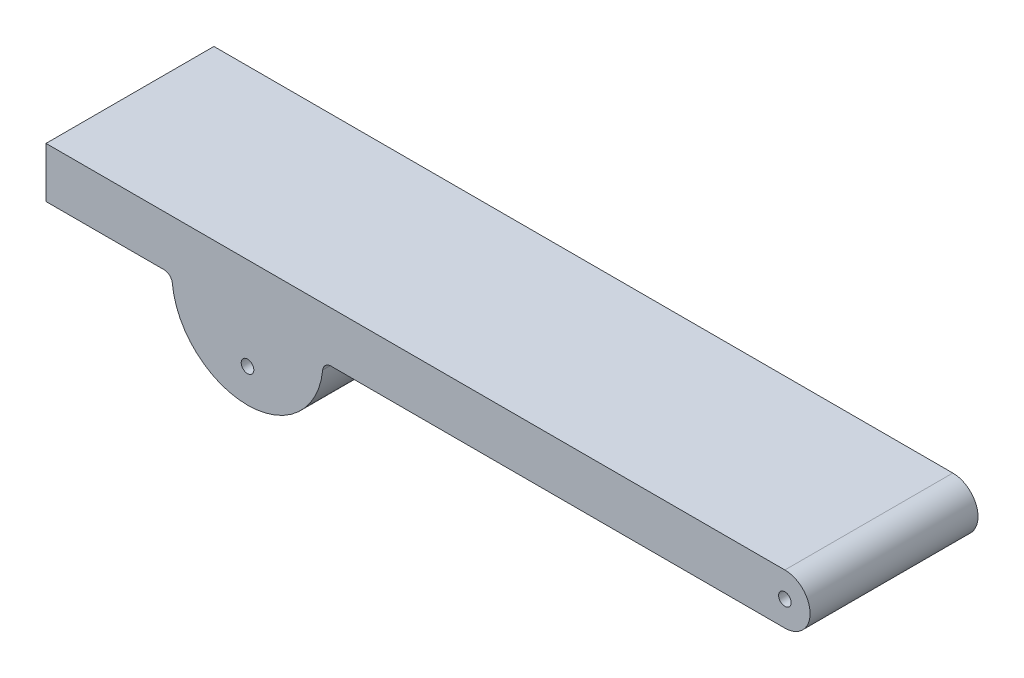
ISO-10303-21;
HEADER;
FILE_DESCRIPTION(('STEP AP214'),'2;1');
FILE_NAME('part.step','',(''),(''),'','','');
FILE_SCHEMA(('AUTOMOTIVE_DESIGN { 1 0 10303 214 1 1 1 1 }'));
ENDSEC;
DATA;
#1=APPLICATION_CONTEXT('core data for automotive mechanical design processes');
#2=APPLICATION_PROTOCOL_DEFINITION('international standard','automotive_design',2000,#1);
#3=PRODUCT_CONTEXT('',#1,'mechanical');
#4=PRODUCT('Part','Part','',(#3));
#5=PRODUCT_RELATED_PRODUCT_CATEGORY('part','',(#4));
#6=PRODUCT_DEFINITION_FORMATION('','',#4);
#7=PRODUCT_DEFINITION_CONTEXT('part definition',#1,'design');
#8=PRODUCT_DEFINITION('design','',#6,#7);
#9=PRODUCT_DEFINITION_SHAPE('','',#8);
#10=(LENGTH_UNIT() NAMED_UNIT(*) SI_UNIT(.MILLI.,.METRE.));
#11=(NAMED_UNIT(*) PLANE_ANGLE_UNIT() SI_UNIT($,.RADIAN.));
#12=(NAMED_UNIT(*) SI_UNIT($,.STERADIAN.) SOLID_ANGLE_UNIT());
#13=UNCERTAINTY_MEASURE_WITH_UNIT(LENGTH_MEASURE(1.E-05),#10,'distance_accuracy_value','');
#14=(GEOMETRIC_REPRESENTATION_CONTEXT(3) GLOBAL_UNCERTAINTY_ASSIGNED_CONTEXT((#13)) GLOBAL_UNIT_ASSIGNED_CONTEXT((#10,
#11,#12)) REPRESENTATION_CONTEXT('',''));
#15=CARTESIAN_POINT('',(0.,0.,0.));
#16=DIRECTION('',(0.,0.,1.));
#17=DIRECTION('',(1.,0.,0.));
#18=AXIS2_PLACEMENT_3D('',#15,#16,#17);
#19=CARTESIAN_POINT('',(-440.,-29.9999999999969,100.));
#20=DIRECTION('',(1.,0.,0.));
#21=DIRECTION('',(0.,0.,1.));
#22=AXIS2_PLACEMENT_3D('',#19,#20,#21);
#23=PLANE('',#22);
#24=DIRECTION('',(0.,-1.,0.));
#25=VECTOR('',#24,1.);
#26=CARTESIAN_POINT('',(-440.,-29.9999999999969,-100.));
#27=LINE('',#26,#25);
#28=CARTESIAN_POINT('',(-440.,30.0000000000028,-100.));
#29=VERTEX_POINT('',#28);
#30=CARTESIAN_POINT('',(-440.,-29.9999999999969,-100.));
#31=VERTEX_POINT('',#30);
#32=EDGE_CURVE('E128',#29,#31,#27,.T.);
#33=ORIENTED_EDGE('',*,*,#32,.T.);
#34=DIRECTION('',(0.,0.,-1.));
#35=VECTOR('',#34,1.);
#36=CARTESIAN_POINT('',(-440.,-29.9999999999969,100.));
#37=LINE('',#36,#35);
#38=CARTESIAN_POINT('',(-440.,-29.9999999999969,100.));
#39=VERTEX_POINT('',#38);
#40=EDGE_CURVE('E109',#39,#31,#37,.T.);
#41=ORIENTED_EDGE('',*,*,#40,.F.);
#42=DIRECTION('',(0.,-1.,0.));
#43=VECTOR('',#42,1.);
#44=CARTESIAN_POINT('',(-440.,-29.9999999999969,100.));
#45=LINE('',#44,#43);
#46=CARTESIAN_POINT('',(-440.,30.0000000000028,100.));
#47=VERTEX_POINT('',#46);
#48=EDGE_CURVE('E115',#47,#39,#45,.T.);
#49=ORIENTED_EDGE('',*,*,#48,.F.);
#50=DIRECTION('',(0.,0.,-1.));
#51=VECTOR('',#50,1.);
#52=CARTESIAN_POINT('',(-440.,30.0000000000028,100.));
#53=LINE('',#52,#51);
#54=EDGE_CURVE('E192',#47,#29,#53,.T.);
#55=ORIENTED_EDGE('',*,*,#54,.T.);
#56=EDGE_LOOP('',(#33,#41,#49,#55));
#57=FACE_BOUND('',#56,.T.);
#58=ADVANCED_FACE('F43',(#57),#23,.F.);
#59=CARTESIAN_POINT('',(-440.,-29.9999999999969,100.));
#60=DIRECTION('',(0.,1.,0.));
#61=DIRECTION('',(-1.,0.,0.));
#62=AXIS2_PLACEMENT_3D('',#59,#60,#61);
#63=PLANE('',#62);
#64=DIRECTION('',(1.,0.,0.));
#65=VECTOR('',#64,1.);
#66=CARTESIAN_POINT('',(-440.,-29.9999999999969,-100.));
#67=LINE('',#66,#65);
#68=CARTESIAN_POINT('',(-299.498743710662,-29.999999999998,-100.));
#69=VERTEX_POINT('',#68);
#70=EDGE_CURVE('E180',#31,#69,#67,.T.);
#71=ORIENTED_EDGE('',*,*,#70,.T.);
#72=DIRECTION('',(0.,0.,1.));
#73=VECTOR('',#72,1.);
#74=CARTESIAN_POINT('',(-299.498743710662,-29.999999999998,100.));
#75=LINE('',#74,#73);
#76=CARTESIAN_POINT('',(-299.498743710662,-29.999999999998,100.));
#77=VERTEX_POINT('',#76);
#78=EDGE_CURVE('E59',#69,#77,#75,.T.);
#79=ORIENTED_EDGE('',*,*,#78,.T.);
#80=DIRECTION('',(1.,0.,0.));
#81=VECTOR('',#80,1.);
#82=CARTESIAN_POINT('',(-440.,-29.9999999999969,100.));
#83=LINE('',#82,#81);
#84=EDGE_CURVE('E105',#39,#77,#83,.T.);
#85=ORIENTED_EDGE('',*,*,#84,.F.);
#86=ORIENTED_EDGE('',*,*,#40,.T.);
#87=EDGE_LOOP('',(#71,#79,#85,#86));
#88=FACE_BOUND('',#87,.T.);
#89=ADVANCED_FACE('F107',(#88),#63,.F.);
#90=CARTESIAN_POINT('',(-200.,-29.9999999999987,100.));
#91=DIRECTION('',(0.,0.,-1.));
#92=DIRECTION('',(1.,0.,0.));
#93=AXIS2_PLACEMENT_3D('',#90,#91,#92);
#94=CYLINDRICAL_SURFACE('',#93,90.);
#95=CARTESIAN_POINT('',(-200.,-29.9999999999987,-100.));
#96=DIRECTION('',(0.,0.,1.));
#97=DIRECTION('',(1.,0.,0.));
#98=AXIS2_PLACEMENT_3D('',#95,#96,#97);
#99=CIRCLE('',#98,90.);
#100=CARTESIAN_POINT('',(-289.548869339596,-38.9999999999981,-100.));
#101=VERTEX_POINT('',#100);
#102=CARTESIAN_POINT('',(-110.451130660404,-38.9999999999993,-100.));
#103=VERTEX_POINT('',#102);
#104=EDGE_CURVE('E161',#101,#103,#99,.T.);
#105=ORIENTED_EDGE('',*,*,#104,.T.);
#106=DIRECTION('',(0.,0.,-1.));
#107=VECTOR('',#106,1.);
#108=CARTESIAN_POINT('',(-110.451130660404,-38.9999999999993,100.));
#109=LINE('',#108,#107);
#110=CARTESIAN_POINT('',(-110.451130660404,-38.9999999999993,100.));
#111=VERTEX_POINT('',#110);
#112=EDGE_CURVE('E148',#103,#111,#109,.F.);
#113=ORIENTED_EDGE('',*,*,#112,.T.);
#114=CARTESIAN_POINT('',(-200.,-29.9999999999987,100.));
#115=DIRECTION('',(0.,0.,1.));
#116=DIRECTION('',(1.,0.,0.));
#117=AXIS2_PLACEMENT_3D('',#114,#115,#116);
#118=CIRCLE('',#117,90.);
#119=CARTESIAN_POINT('',(-289.548869339596,-38.9999999999981,100.));
#120=VERTEX_POINT('',#119);
#121=EDGE_CURVE('E114',#120,#111,#118,.T.);
#122=ORIENTED_EDGE('',*,*,#121,.F.);
#123=DIRECTION('',(0.,0.,-1.));
#124=VECTOR('',#123,1.);
#125=CARTESIAN_POINT('',(-289.548869339596,-38.9999999999981,100.));
#126=LINE('',#125,#124);
#127=EDGE_CURVE('E137',#120,#101,#126,.T.);
#128=ORIENTED_EDGE('',*,*,#127,.T.);
#129=EDGE_LOOP('',(#105,#113,#122,#128));
#130=FACE_BOUND('',#129,.T.);
#131=ADVANCED_FACE('F241',(#130),#94,.T.);
#132=CARTESIAN_POINT('',(-110.,-29.9999999999993,100.));
#133=DIRECTION('',(0.,1.,0.));
#134=DIRECTION('',(-1.,0.,0.));
#135=AXIS2_PLACEMENT_3D('',#132,#133,#134);
#136=PLANE('',#135);
#137=DIRECTION('',(1.,0.,0.));
#138=VECTOR('',#137,1.);
#139=CARTESIAN_POINT('',(-110.,-29.9999999999993,100.));
#140=LINE('',#139,#138);
#141=CARTESIAN_POINT('',(-100.501256289338,-29.9999999999994,100.));
#142=VERTEX_POINT('',#141);
#143=CARTESIAN_POINT('',(440.,-30.0000000000028,100.));
#144=VERTEX_POINT('',#143);
#145=EDGE_CURVE('E169',#142,#144,#140,.T.);
#146=ORIENTED_EDGE('',*,*,#145,.F.);
#147=DIRECTION('',(0.,0.,1.));
#148=VECTOR('',#147,1.);
#149=CARTESIAN_POINT('',(-100.501256289338,-29.9999999999994,-100.));
#150=LINE('',#149,#148);
#151=CARTESIAN_POINT('',(-100.501256289338,-29.9999999999994,-100.));
#152=VERTEX_POINT('',#151);
#153=EDGE_CURVE('E130',#142,#152,#150,.F.);
#154=ORIENTED_EDGE('',*,*,#153,.T.);
#155=DIRECTION('',(1.,0.,0.));
#156=VECTOR('',#155,1.);
#157=CARTESIAN_POINT('',(-110.,-29.9999999999993,-100.));
#158=LINE('',#157,#156);
#159=CARTESIAN_POINT('',(440.,-30.0000000000028,-100.));
#160=VERTEX_POINT('',#159);
#161=EDGE_CURVE('E183',#152,#160,#158,.T.);
#162=ORIENTED_EDGE('',*,*,#161,.T.);
#163=DIRECTION('',(0.,0.,-1.));
#164=VECTOR('',#163,1.);
#165=CARTESIAN_POINT('',(440.,-30.0000000000028,100.));
#166=LINE('',#165,#164);
#167=EDGE_CURVE('E131',#144,#160,#166,.T.);
#168=ORIENTED_EDGE('',*,*,#167,.F.);
#169=EDGE_LOOP('',(#146,#154,#162,#168));
#170=FACE_BOUND('',#169,.T.);
#171=ADVANCED_FACE('F257',(#170),#136,.F.);
#172=CARTESIAN_POINT('',(440.,-2.97912542316143E-12,100.));
#173=DIRECTION('',(0.,0.,-1.));
#174=DIRECTION('',(1.,0.,0.));
#175=AXIS2_PLACEMENT_3D('',#172,#173,#174);
#176=CYLINDRICAL_SURFACE('',#175,29.9999999999999);
#177=CARTESIAN_POINT('',(440.,-2.97912542316143E-12,-100.));
#178=DIRECTION('',(0.,0.,1.));
#179=DIRECTION('',(-1.,0.,0.));
#180=AXIS2_PLACEMENT_3D('',#177,#178,#179);
#181=CIRCLE('',#180,29.9999999999999);
#182=CARTESIAN_POINT('',(440.,29.9999999999969,-100.));
#183=VERTEX_POINT('',#182);
#184=EDGE_CURVE('E185',#160,#183,#181,.T.);
#185=ORIENTED_EDGE('',*,*,#184,.T.);
#186=DIRECTION('',(0.,0.,-1.));
#187=VECTOR('',#186,1.);
#188=CARTESIAN_POINT('',(440.,29.9999999999969,100.));
#189=LINE('',#188,#187);
#190=CARTESIAN_POINT('',(440.,29.9999999999969,100.));
#191=VERTEX_POINT('',#190);
#192=EDGE_CURVE('E141',#191,#183,#189,.T.);
#193=ORIENTED_EDGE('',*,*,#192,.F.);
#194=CARTESIAN_POINT('',(440.,-2.97912542316143E-12,100.));
#195=DIRECTION('',(0.,0.,1.));
#196=DIRECTION('',(-1.,0.,0.));
#197=AXIS2_PLACEMENT_3D('',#194,#195,#196);
#198=CIRCLE('',#197,29.9999999999999);
#199=EDGE_CURVE('E172',#144,#191,#198,.T.);
#200=ORIENTED_EDGE('',*,*,#199,.F.);
#201=ORIENTED_EDGE('',*,*,#167,.T.);
#202=EDGE_LOOP('',(#185,#193,#200,#201));
#203=FACE_BOUND('',#202,.T.);
#204=ADVANCED_FACE('F262',(#203),#176,.T.);
#205=CARTESIAN_POINT('',(-440.,30.0000000000028,100.));
#206=DIRECTION('',(0.,-1.,0.));
#207=DIRECTION('',(1.,0.,0.));
#208=AXIS2_PLACEMENT_3D('',#205,#206,#207);
#209=PLANE('',#208);
#210=DIRECTION('',(-1.,0.,0.));
#211=VECTOR('',#210,1.);
#212=CARTESIAN_POINT('',(-440.,30.0000000000028,-100.));
#213=LINE('',#212,#211);
#214=EDGE_CURVE('E125',#183,#29,#213,.T.);
#215=ORIENTED_EDGE('',*,*,#214,.T.);
#216=ORIENTED_EDGE('',*,*,#54,.F.);
#217=DIRECTION('',(-1.,0.,0.));
#218=VECTOR('',#217,1.);
#219=CARTESIAN_POINT('',(-440.,30.0000000000028,100.));
#220=LINE('',#219,#218);
#221=EDGE_CURVE('E120',#191,#47,#220,.T.);
#222=ORIENTED_EDGE('',*,*,#221,.F.);
#223=ORIENTED_EDGE('',*,*,#192,.T.);
#224=EDGE_LOOP('',(#215,#216,#222,#223));
#225=FACE_BOUND('',#224,.T.);
#226=ADVANCED_FACE('F224',(#225),#209,.F.);
#227=CARTESIAN_POINT('',(440.,-2.97912542316143E-12,100.));
#228=DIRECTION('',(0.,0.,1.));
#229=DIRECTION('',(-1.,0.,0.));
#230=AXIS2_PLACEMENT_3D('',#227,#228,#229);
#231=PLANE('',#230);
#232=CARTESIAN_POINT('',(-200.000000000001,-79.9999999999986,100.));
#233=DIRECTION('',(0.,0.,1.));
#234=DIRECTION('',(-1.,0.,0.));
#235=AXIS2_PLACEMENT_3D('',#232,#233,#234);
#236=CIRCLE('',#235,7.50000000000001);
#237=CARTESIAN_POINT('',(-207.500000000001,-79.9999999999986,100.));
#238=VERTEX_POINT('',#237);
#239=EDGE_CURVE('E163',#238,#238,#236,.T.);
#240=ORIENTED_EDGE('',*,*,#239,.F.);
#241=EDGE_LOOP('',(#240));
#242=FACE_BOUND('',#241,.T.);
#243=CARTESIAN_POINT('',(440.,-2.97912542316143E-12,100.));
#244=DIRECTION('',(0.,0.,1.));
#245=DIRECTION('',(-1.,0.,0.));
#246=AXIS2_PLACEMENT_3D('',#243,#244,#245);
#247=CIRCLE('',#246,7.50000000000001);
#248=CARTESIAN_POINT('',(432.5,-2.92675320307878E-12,100.));
#249=VERTEX_POINT('',#248);
#250=EDGE_CURVE('E177',#249,#249,#247,.T.);
#251=ORIENTED_EDGE('',*,*,#250,.F.);
#252=EDGE_LOOP('',(#251));
#253=FACE_BOUND('',#252,.T.);
#254=ORIENTED_EDGE('',*,*,#48,.T.);
#255=ORIENTED_EDGE('',*,*,#84,.T.);
#256=CARTESIAN_POINT('',(-299.498743710662,-39.999999999998,100.));
#257=DIRECTION('',(0.,0.,1.));
#258=DIRECTION('',(-1.,0.,0.));
#259=AXIS2_PLACEMENT_3D('',#256,#257,#258);
#260=CIRCLE('',#259,10.);
#261=EDGE_CURVE('E11',#77,#120,#260,.F.);
#262=ORIENTED_EDGE('',*,*,#261,.T.);
#263=ORIENTED_EDGE('',*,*,#121,.T.);
#264=CARTESIAN_POINT('',(-100.501256289338,-39.9999999999994,100.));
#265=DIRECTION('',(0.,0.,1.));
#266=DIRECTION('',(-1.,0.,0.));
#267=AXIS2_PLACEMENT_3D('',#264,#265,#266);
#268=CIRCLE('',#267,10.);
#269=EDGE_CURVE('E156',#111,#142,#268,.F.);
#270=ORIENTED_EDGE('',*,*,#269,.T.);
#271=ORIENTED_EDGE('',*,*,#145,.T.);
#272=ORIENTED_EDGE('',*,*,#199,.T.);
#273=ORIENTED_EDGE('',*,*,#221,.T.);
#274=EDGE_LOOP('',(#254,#255,#262,#263,#270,#271,#272,#273));
#275=FACE_BOUND('',#274,.T.);
#276=ADVANCED_FACE('F118',(#242,#253,#275),#231,.T.);
#277=CARTESIAN_POINT('',(440.,-2.97912542316143E-12,-100.));
#278=DIRECTION('',(0.,0.,1.));
#279=DIRECTION('',(-1.,0.,0.));
#280=AXIS2_PLACEMENT_3D('',#277,#278,#279);
#281=PLANE('',#280);
#282=CARTESIAN_POINT('',(-200.000000000001,-79.9999999999986,-100.));
#283=DIRECTION('',(0.,0.,1.));
#284=DIRECTION('',(-1.,0.,0.));
#285=AXIS2_PLACEMENT_3D('',#282,#283,#284);
#286=CIRCLE('',#285,7.50000000000001);
#287=CARTESIAN_POINT('',(-207.500000000001,-79.9999999999986,-100.));
#288=VERTEX_POINT('',#287);
#289=EDGE_CURVE('E165',#288,#288,#286,.T.);
#290=ORIENTED_EDGE('',*,*,#289,.T.);
#291=EDGE_LOOP('',(#290));
#292=FACE_BOUND('',#291,.T.);
#293=CARTESIAN_POINT('',(440.,-2.97912542316143E-12,-100.));
#294=DIRECTION('',(0.,0.,1.));
#295=DIRECTION('',(-1.,0.,0.));
#296=AXIS2_PLACEMENT_3D('',#293,#294,#295);
#297=CIRCLE('',#296,7.50000000000001);
#298=CARTESIAN_POINT('',(432.5,-2.92675320307878E-12,-100.));
#299=VERTEX_POINT('',#298);
#300=EDGE_CURVE('E175',#299,#299,#297,.T.);
#301=ORIENTED_EDGE('',*,*,#300,.T.);
#302=EDGE_LOOP('',(#301));
#303=FACE_BOUND('',#302,.T.);
#304=ORIENTED_EDGE('',*,*,#32,.F.);
#305=ORIENTED_EDGE('',*,*,#214,.F.);
#306=ORIENTED_EDGE('',*,*,#184,.F.);
#307=ORIENTED_EDGE('',*,*,#161,.F.);
#308=CARTESIAN_POINT('',(-100.501256289338,-39.9999999999994,-100.));
#309=DIRECTION('',(0.,0.,1.));
#310=DIRECTION('',(-1.,0.,0.));
#311=AXIS2_PLACEMENT_3D('',#308,#309,#310);
#312=CIRCLE('',#311,10.);
#313=EDGE_CURVE('E153',#152,#103,#312,.T.);
#314=ORIENTED_EDGE('',*,*,#313,.T.);
#315=ORIENTED_EDGE('',*,*,#104,.F.);
#316=CARTESIAN_POINT('',(-299.498743710662,-39.999999999998,-100.));
#317=DIRECTION('',(0.,0.,1.));
#318=DIRECTION('',(-1.,0.,0.));
#319=AXIS2_PLACEMENT_3D('',#316,#317,#318);
#320=CIRCLE('',#319,10.);
#321=EDGE_CURVE('E52',#101,#69,#320,.T.);
#322=ORIENTED_EDGE('',*,*,#321,.T.);
#323=ORIENTED_EDGE('',*,*,#70,.F.);
#324=EDGE_LOOP('',(#304,#305,#306,#307,#314,#315,#322,#323));
#325=FACE_BOUND('',#324,.T.);
#326=ADVANCED_FACE('F211',(#292,#303,#325),#281,.F.);
#327=CARTESIAN_POINT('',(440.,-2.97912542316143E-12,-100.));
#328=DIRECTION('',(0.,0.,1.));
#329=DIRECTION('',(-1.,0.,0.));
#330=AXIS2_PLACEMENT_3D('',#327,#328,#329);
#331=CYLINDRICAL_SURFACE('',#330,7.50000000000001);
#332=ORIENTED_EDGE('',*,*,#300,.F.);
#333=EDGE_LOOP('',(#332));
#334=FACE_BOUND('',#333,.T.);
#335=ORIENTED_EDGE('',*,*,#250,.T.);
#336=EDGE_LOOP('',(#335));
#337=FACE_BOUND('',#336,.T.);
#338=ADVANCED_FACE('F218',(#334,#337),#331,.F.);
#339=CARTESIAN_POINT('',(-200.000000000001,-79.9999999999986,-100.));
#340=DIRECTION('',(0.,0.,1.));
#341=DIRECTION('',(-1.,0.,0.));
#342=AXIS2_PLACEMENT_3D('',#339,#340,#341);
#343=CYLINDRICAL_SURFACE('',#342,7.50000000000001);
#344=ORIENTED_EDGE('',*,*,#289,.F.);
#345=EDGE_LOOP('',(#344));
#346=FACE_BOUND('',#345,.T.);
#347=ORIENTED_EDGE('',*,*,#239,.T.);
#348=EDGE_LOOP('',(#347));
#349=FACE_BOUND('',#348,.T.);
#350=ADVANCED_FACE('F214',(#346,#349),#343,.F.);
#351=CARTESIAN_POINT('',(-100.501256289338,-39.9999999999994,100.));
#352=DIRECTION('',(0.,0.,-1.));
#353=DIRECTION('',(1.,0.,0.));
#354=AXIS2_PLACEMENT_3D('',#351,#352,#353);
#355=CYLINDRICAL_SURFACE('',#354,10.);
#356=ORIENTED_EDGE('',*,*,#269,.F.);
#357=ORIENTED_EDGE('',*,*,#112,.F.);
#358=ORIENTED_EDGE('',*,*,#313,.F.);
#359=ORIENTED_EDGE('',*,*,#153,.F.);
#360=EDGE_LOOP('',(#356,#357,#358,#359));
#361=FACE_BOUND('',#360,.T.);
#362=ADVANCED_FACE('F217',(#361),#355,.F.);
#363=CARTESIAN_POINT('',(-299.498743710662,-39.999999999998,100.));
#364=DIRECTION('',(0.,0.,-1.));
#365=DIRECTION('',(1.,0.,0.));
#366=AXIS2_PLACEMENT_3D('',#363,#364,#365);
#367=CYLINDRICAL_SURFACE('',#366,10.);
#368=ORIENTED_EDGE('',*,*,#261,.F.);
#369=ORIENTED_EDGE('',*,*,#78,.F.);
#370=ORIENTED_EDGE('',*,*,#321,.F.);
#371=ORIENTED_EDGE('',*,*,#127,.F.);
#372=EDGE_LOOP('',(#368,#369,#370,#371));
#373=FACE_BOUND('',#372,.T.);
#374=ADVANCED_FACE('F45',(#373),#367,.F.);
#375=CLOSED_SHELL('',(#58,#89,#131,#171,#204,#226,#276,#326,#338,#350,#362,#374));
#376=MANIFOLD_SOLID_BREP('B2',#375);
#377=ADVANCED_BREP_SHAPE_REPRESENTATION('',(#18,#376),#14);
#378=SHAPE_DEFINITION_REPRESENTATION(#9,#377);
ENDSEC;
END-ISO-10303-21;
